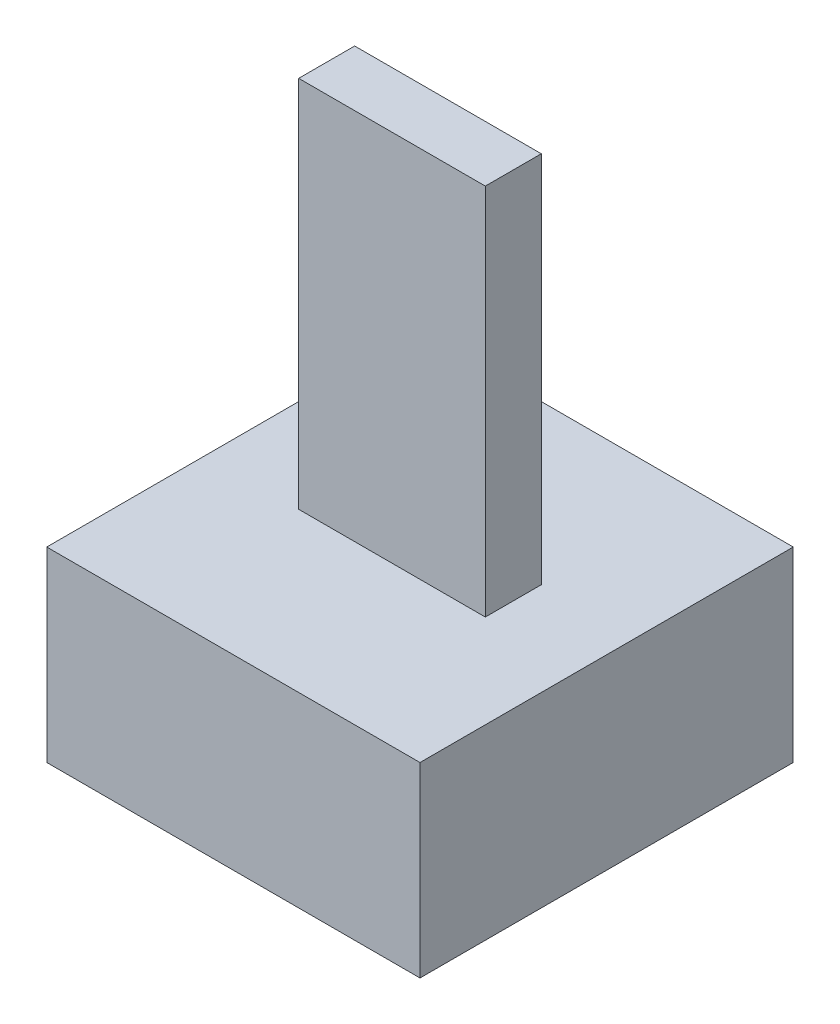
ISO-10303-21;
HEADER;
FILE_DESCRIPTION(('STEP AP214'),'2;1');
FILE_NAME('part.step','',(''),(''),'','','');
FILE_SCHEMA(('AUTOMOTIVE_DESIGN { 1 0 10303 214 1 1 1 1 }'));
ENDSEC;
DATA;
#1=APPLICATION_CONTEXT('core data for automotive mechanical design processes');
#2=APPLICATION_PROTOCOL_DEFINITION('international standard','automotive_design',2000,#1);
#3=PRODUCT_CONTEXT('',#1,'mechanical');
#4=PRODUCT('Part','Part','',(#3));
#5=PRODUCT_RELATED_PRODUCT_CATEGORY('part','',(#4));
#6=PRODUCT_DEFINITION_FORMATION('','',#4);
#7=PRODUCT_DEFINITION_CONTEXT('part definition',#1,'design');
#8=PRODUCT_DEFINITION('design','',#6,#7);
#9=PRODUCT_DEFINITION_SHAPE('','',#8);
#10=(LENGTH_UNIT() NAMED_UNIT(*) SI_UNIT(.MILLI.,.METRE.));
#11=(NAMED_UNIT(*) PLANE_ANGLE_UNIT() SI_UNIT($,.RADIAN.));
#12=(NAMED_UNIT(*) SI_UNIT($,.STERADIAN.) SOLID_ANGLE_UNIT());
#13=UNCERTAINTY_MEASURE_WITH_UNIT(LENGTH_MEASURE(1.E-05),#10,'distance_accuracy_value','');
#14=(GEOMETRIC_REPRESENTATION_CONTEXT(3) GLOBAL_UNCERTAINTY_ASSIGNED_CONTEXT((#13)) GLOBAL_UNIT_ASSIGNED_CONTEXT((#10,
#11,#12)) REPRESENTATION_CONTEXT('',''));
#15=CARTESIAN_POINT('',(0.,0.,0.));
#16=DIRECTION('',(0.,0.,1.));
#17=DIRECTION('',(1.,0.,0.));
#18=AXIS2_PLACEMENT_3D('',#15,#16,#17);
#19=CARTESIAN_POINT('',(5.,5.,-5.));
#20=DIRECTION('',(-1.,0.,0.));
#21=DIRECTION('',(0.,0.,1.));
#22=AXIS2_PLACEMENT_3D('',#19,#20,#21);
#23=PLANE('',#22);
#24=DIRECTION('',(0.,0.,-1.));
#25=VECTOR('',#24,1.);
#26=CARTESIAN_POINT('',(5.,0.,-5.));
#27=LINE('',#26,#25);
#28=CARTESIAN_POINT('',(5.,0.,5.));
#29=VERTEX_POINT('',#28);
#30=CARTESIAN_POINT('',(5.,0.,-5.));
#31=VERTEX_POINT('',#30);
#32=EDGE_CURVE('E127',#29,#31,#27,.T.);
#33=ORIENTED_EDGE('',*,*,#32,.T.);
#34=DIRECTION('',(0.,-1.,0.));
#35=VECTOR('',#34,1.);
#36=CARTESIAN_POINT('',(5.,5.,-5.));
#37=LINE('',#36,#35);
#38=CARTESIAN_POINT('',(5.,5.,-5.));
#39=VERTEX_POINT('',#38);
#40=EDGE_CURVE('E11',#39,#31,#37,.T.);
#41=ORIENTED_EDGE('',*,*,#40,.F.);
#42=DIRECTION('',(0.,0.,-1.));
#43=VECTOR('',#42,1.);
#44=CARTESIAN_POINT('',(5.,5.,-5.));
#45=LINE('',#44,#43);
#46=CARTESIAN_POINT('',(5.,5.,5.));
#47=VERTEX_POINT('',#46);
#48=EDGE_CURVE('E138',#47,#39,#45,.T.);
#49=ORIENTED_EDGE('',*,*,#48,.F.);
#50=DIRECTION('',(0.,-1.,0.));
#51=VECTOR('',#50,1.);
#52=CARTESIAN_POINT('',(5.,5.,5.));
#53=LINE('',#52,#51);
#54=EDGE_CURVE('E151',#47,#29,#53,.T.);
#55=ORIENTED_EDGE('',*,*,#54,.T.);
#56=EDGE_LOOP('',(#33,#41,#49,#55));
#57=FACE_BOUND('',#56,.T.);
#58=ADVANCED_FACE('F39',(#57),#23,.F.);
#59=CARTESIAN_POINT('',(-5.,5.,-5.));
#60=DIRECTION('',(0.,0.,1.));
#61=DIRECTION('',(1.,0.,0.));
#62=AXIS2_PLACEMENT_3D('',#59,#60,#61);
#63=PLANE('',#62);
#64=DIRECTION('',(-1.,0.,0.));
#65=VECTOR('',#64,1.);
#66=CARTESIAN_POINT('',(-5.,0.,-5.));
#67=LINE('',#66,#65);
#68=CARTESIAN_POINT('',(-5.,0.,-5.));
#69=VERTEX_POINT('',#68);
#70=EDGE_CURVE('E132',#31,#69,#67,.T.);
#71=ORIENTED_EDGE('',*,*,#70,.T.);
#72=DIRECTION('',(0.,-1.,0.));
#73=VECTOR('',#72,1.);
#74=CARTESIAN_POINT('',(-5.,5.,-5.));
#75=LINE('',#74,#73);
#76=CARTESIAN_POINT('',(-5.,5.,-5.));
#77=VERTEX_POINT('',#76);
#78=EDGE_CURVE('E47',#77,#69,#75,.T.);
#79=ORIENTED_EDGE('',*,*,#78,.F.);
#80=DIRECTION('',(-1.,0.,0.));
#81=VECTOR('',#80,1.);
#82=CARTESIAN_POINT('',(-5.,5.,-5.));
#83=LINE('',#82,#81);
#84=EDGE_CURVE('E142',#39,#77,#83,.T.);
#85=ORIENTED_EDGE('',*,*,#84,.F.);
#86=ORIENTED_EDGE('',*,*,#40,.T.);
#87=EDGE_LOOP('',(#71,#79,#85,#86));
#88=FACE_BOUND('',#87,.T.);
#89=ADVANCED_FACE('F188',(#88),#63,.F.);
#90=CARTESIAN_POINT('',(-5.,5.,-5.));
#91=DIRECTION('',(1.,0.,0.));
#92=DIRECTION('',(0.,0.,-1.));
#93=AXIS2_PLACEMENT_3D('',#90,#91,#92);
#94=PLANE('',#93);
#95=DIRECTION('',(0.,0.,1.));
#96=VECTOR('',#95,1.);
#97=CARTESIAN_POINT('',(-5.,0.,-5.));
#98=LINE('',#97,#96);
#99=CARTESIAN_POINT('',(-5.,0.,5.));
#100=VERTEX_POINT('',#99);
#101=EDGE_CURVE('E155',#69,#100,#98,.T.);
#102=ORIENTED_EDGE('',*,*,#101,.T.);
#103=DIRECTION('',(0.,-1.,0.));
#104=VECTOR('',#103,1.);
#105=CARTESIAN_POINT('',(-5.,5.,5.));
#106=LINE('',#105,#104);
#107=CARTESIAN_POINT('',(-5.,5.,5.));
#108=VERTEX_POINT('',#107);
#109=EDGE_CURVE('E163',#108,#100,#106,.T.);
#110=ORIENTED_EDGE('',*,*,#109,.F.);
#111=DIRECTION('',(0.,0.,1.));
#112=VECTOR('',#111,1.);
#113=CARTESIAN_POINT('',(-5.,5.,-5.));
#114=LINE('',#113,#112);
#115=EDGE_CURVE('E146',#77,#108,#114,.T.);
#116=ORIENTED_EDGE('',*,*,#115,.F.);
#117=ORIENTED_EDGE('',*,*,#78,.T.);
#118=EDGE_LOOP('',(#102,#110,#116,#117));
#119=FACE_BOUND('',#118,.T.);
#120=ADVANCED_FACE('F172',(#119),#94,.F.);
#121=CARTESIAN_POINT('',(-5.,5.,5.));
#122=DIRECTION('',(0.,0.,-1.));
#123=DIRECTION('',(-1.,0.,0.));
#124=AXIS2_PLACEMENT_3D('',#121,#122,#123);
#125=PLANE('',#124);
#126=DIRECTION('',(1.,0.,0.));
#127=VECTOR('',#126,1.);
#128=CARTESIAN_POINT('',(-5.,0.,5.));
#129=LINE('',#128,#127);
#130=EDGE_CURVE('E143',#100,#29,#129,.T.);
#131=ORIENTED_EDGE('',*,*,#130,.T.);
#132=ORIENTED_EDGE('',*,*,#54,.F.);
#133=DIRECTION('',(1.,0.,0.));
#134=VECTOR('',#133,1.);
#135=CARTESIAN_POINT('',(-5.,5.,5.));
#136=LINE('',#135,#134);
#137=EDGE_CURVE('E149',#108,#47,#136,.T.);
#138=ORIENTED_EDGE('',*,*,#137,.F.);
#139=ORIENTED_EDGE('',*,*,#109,.T.);
#140=EDGE_LOOP('',(#131,#132,#138,#139));
#141=FACE_BOUND('',#140,.T.);
#142=ADVANCED_FACE('F181',(#141),#125,.F.);
#143=CARTESIAN_POINT('',(0.,5.,0.));
#144=DIRECTION('',(0.,1.,0.));
#145=DIRECTION('',(0.,0.,1.));
#146=AXIS2_PLACEMENT_3D('',#143,#144,#145);
#147=PLANE('',#146);
#148=DIRECTION('',(0.,0.,-1.));
#149=VECTOR('',#148,1.);
#150=CARTESIAN_POINT('',(2.5,5.,-0.75));
#151=LINE('',#150,#149);
#152=CARTESIAN_POINT('',(2.5,5.,0.75));
#153=VERTEX_POINT('',#152);
#154=CARTESIAN_POINT('',(2.5,5.,-0.75));
#155=VERTEX_POINT('',#154);
#156=EDGE_CURVE('E54',#153,#155,#151,.T.);
#157=ORIENTED_EDGE('',*,*,#156,.F.);
#158=DIRECTION('',(1.,0.,0.));
#159=VECTOR('',#158,1.);
#160=CARTESIAN_POINT('',(-2.5,5.,0.75));
#161=LINE('',#160,#159);
#162=CARTESIAN_POINT('',(-2.5,5.,0.75));
#163=VERTEX_POINT('',#162);
#164=EDGE_CURVE('E58',#163,#153,#161,.T.);
#165=ORIENTED_EDGE('',*,*,#164,.F.);
#166=DIRECTION('',(0.,0.,1.));
#167=VECTOR('',#166,1.);
#168=CARTESIAN_POINT('',(-2.5,5.,-0.75));
#169=LINE('',#168,#167);
#170=CARTESIAN_POINT('',(-2.5,5.,-0.75));
#171=VERTEX_POINT('',#170);
#172=EDGE_CURVE('E283',#171,#163,#169,.T.);
#173=ORIENTED_EDGE('',*,*,#172,.F.);
#174=DIRECTION('',(-1.,0.,0.));
#175=VECTOR('',#174,1.);
#176=CARTESIAN_POINT('',(-2.5,5.,-0.75));
#177=LINE('',#176,#175);
#178=EDGE_CURVE('E293',#155,#171,#177,.T.);
#179=ORIENTED_EDGE('',*,*,#178,.F.);
#180=EDGE_LOOP('',(#157,#165,#173,#179));
#181=FACE_BOUND('',#180,.T.);
#182=ORIENTED_EDGE('',*,*,#48,.T.);
#183=ORIENTED_EDGE('',*,*,#84,.T.);
#184=ORIENTED_EDGE('',*,*,#115,.T.);
#185=ORIENTED_EDGE('',*,*,#137,.T.);
#186=EDGE_LOOP('',(#182,#183,#184,#185));
#187=FACE_BOUND('',#186,.T.);
#188=ADVANCED_FACE('F187',(#181,#187),#147,.T.);
#189=CARTESIAN_POINT('',(0.,0.,0.));
#190=DIRECTION('',(0.,1.,0.));
#191=DIRECTION('',(0.,0.,1.));
#192=AXIS2_PLACEMENT_3D('',#189,#190,#191);
#193=PLANE('',#192);
#194=ORIENTED_EDGE('',*,*,#32,.F.);
#195=ORIENTED_EDGE('',*,*,#130,.F.);
#196=ORIENTED_EDGE('',*,*,#101,.F.);
#197=ORIENTED_EDGE('',*,*,#70,.F.);
#198=EDGE_LOOP('',(#194,#195,#196,#197));
#199=FACE_BOUND('',#198,.T.);
#200=ADVANCED_FACE('F178',(#199),#193,.F.);
#201=CARTESIAN_POINT('',(2.5,15.,-0.75));
#202=DIRECTION('',(-1.,0.,0.));
#203=DIRECTION('',(0.,0.,1.));
#204=AXIS2_PLACEMENT_3D('',#201,#202,#203);
#205=PLANE('',#204);
#206=ORIENTED_EDGE('',*,*,#156,.T.);
#207=DIRECTION('',(0.,-1.,0.));
#208=VECTOR('',#207,1.);
#209=CARTESIAN_POINT('',(2.5,15.,-0.75));
#210=LINE('',#209,#208);
#211=CARTESIAN_POINT('',(2.5,15.,-0.75));
#212=VERTEX_POINT('',#211);
#213=EDGE_CURVE('E107',#212,#155,#210,.T.);
#214=ORIENTED_EDGE('',*,*,#213,.F.);
#215=DIRECTION('',(0.,0.,-1.));
#216=VECTOR('',#215,1.);
#217=CARTESIAN_POINT('',(2.5,15.,-0.75));
#218=LINE('',#217,#216);
#219=CARTESIAN_POINT('',(2.5,15.,0.75));
#220=VERTEX_POINT('',#219);
#221=EDGE_CURVE('E114',#220,#212,#218,.T.);
#222=ORIENTED_EDGE('',*,*,#221,.F.);
#223=DIRECTION('',(0.,-1.,0.));
#224=VECTOR('',#223,1.);
#225=CARTESIAN_POINT('',(2.5,15.,0.75));
#226=LINE('',#225,#224);
#227=EDGE_CURVE('E280',#220,#153,#226,.T.);
#228=ORIENTED_EDGE('',*,*,#227,.T.);
#229=EDGE_LOOP('',(#206,#214,#222,#228));
#230=FACE_BOUND('',#229,.T.);
#231=ADVANCED_FACE('F125',(#230),#205,.F.);
#232=CARTESIAN_POINT('',(-2.5,15.,-0.75));
#233=DIRECTION('',(0.,0.,1.));
#234=DIRECTION('',(1.,0.,0.));
#235=AXIS2_PLACEMENT_3D('',#232,#233,#234);
#236=PLANE('',#235);
#237=ORIENTED_EDGE('',*,*,#178,.T.);
#238=DIRECTION('',(0.,-1.,0.));
#239=VECTOR('',#238,1.);
#240=CARTESIAN_POINT('',(-2.5,15.,-0.75));
#241=LINE('',#240,#239);
#242=CARTESIAN_POINT('',(-2.5,15.,-0.75));
#243=VERTEX_POINT('',#242);
#244=EDGE_CURVE('E109',#243,#171,#241,.T.);
#245=ORIENTED_EDGE('',*,*,#244,.F.);
#246=DIRECTION('',(-1.,0.,0.));
#247=VECTOR('',#246,1.);
#248=CARTESIAN_POINT('',(-2.5,15.,-0.75));
#249=LINE('',#248,#247);
#250=EDGE_CURVE('E102',#212,#243,#249,.T.);
#251=ORIENTED_EDGE('',*,*,#250,.F.);
#252=ORIENTED_EDGE('',*,*,#213,.T.);
#253=EDGE_LOOP('',(#237,#245,#251,#252));
#254=FACE_BOUND('',#253,.T.);
#255=ADVANCED_FACE('F105',(#254),#236,.F.);
#256=CARTESIAN_POINT('',(-2.5,15.,-0.75));
#257=DIRECTION('',(1.,0.,0.));
#258=DIRECTION('',(0.,0.,-1.));
#259=AXIS2_PLACEMENT_3D('',#256,#257,#258);
#260=PLANE('',#259);
#261=ORIENTED_EDGE('',*,*,#172,.T.);
#262=DIRECTION('',(0.,-1.,0.));
#263=VECTOR('',#262,1.);
#264=CARTESIAN_POINT('',(-2.5,15.,0.75));
#265=LINE('',#264,#263);
#266=CARTESIAN_POINT('',(-2.5,15.,0.75));
#267=VERTEX_POINT('',#266);
#268=EDGE_CURVE('E134',#267,#163,#265,.T.);
#269=ORIENTED_EDGE('',*,*,#268,.F.);
#270=DIRECTION('',(0.,0.,1.));
#271=VECTOR('',#270,1.);
#272=CARTESIAN_POINT('',(-2.5,15.,-0.75));
#273=LINE('',#272,#271);
#274=EDGE_CURVE('E113',#243,#267,#273,.T.);
#275=ORIENTED_EDGE('',*,*,#274,.F.);
#276=ORIENTED_EDGE('',*,*,#244,.T.);
#277=EDGE_LOOP('',(#261,#269,#275,#276));
#278=FACE_BOUND('',#277,.T.);
#279=ADVANCED_FACE('F206',(#278),#260,.F.);
#280=CARTESIAN_POINT('',(-2.5,15.,0.75));
#281=DIRECTION('',(0.,0.,-1.));
#282=DIRECTION('',(-1.,0.,0.));
#283=AXIS2_PLACEMENT_3D('',#280,#281,#282);
#284=PLANE('',#283);
#285=ORIENTED_EDGE('',*,*,#164,.T.);
#286=ORIENTED_EDGE('',*,*,#227,.F.);
#287=DIRECTION('',(1.,0.,0.));
#288=VECTOR('',#287,1.);
#289=CARTESIAN_POINT('',(-2.5,15.,0.75));
#290=LINE('',#289,#288);
#291=EDGE_CURVE('E119',#267,#220,#290,.T.);
#292=ORIENTED_EDGE('',*,*,#291,.F.);
#293=ORIENTED_EDGE('',*,*,#268,.T.);
#294=EDGE_LOOP('',(#285,#286,#292,#293));
#295=FACE_BOUND('',#294,.T.);
#296=ADVANCED_FACE('F209',(#295),#284,.F.);
#297=CARTESIAN_POINT('',(0.,15.,0.));
#298=DIRECTION('',(0.,1.,0.));
#299=DIRECTION('',(0.,0.,1.));
#300=AXIS2_PLACEMENT_3D('',#297,#298,#299);
#301=PLANE('',#300);
#302=ORIENTED_EDGE('',*,*,#221,.T.);
#303=ORIENTED_EDGE('',*,*,#250,.T.);
#304=ORIENTED_EDGE('',*,*,#274,.T.);
#305=ORIENTED_EDGE('',*,*,#291,.T.);
#306=EDGE_LOOP('',(#302,#303,#304,#305));
#307=FACE_BOUND('',#306,.T.);
#308=ADVANCED_FACE('F117',(#307),#301,.T.);
#309=CLOSED_SHELL('',(#58,#89,#120,#142,#188,#200,#231,#255,#279,#296,#308));
#310=MANIFOLD_SOLID_BREP('B2',#309);
#311=ADVANCED_BREP_SHAPE_REPRESENTATION('',(#18,#310),#14);
#312=SHAPE_DEFINITION_REPRESENTATION(#9,#311);
ENDSEC;
END-ISO-10303-21;
